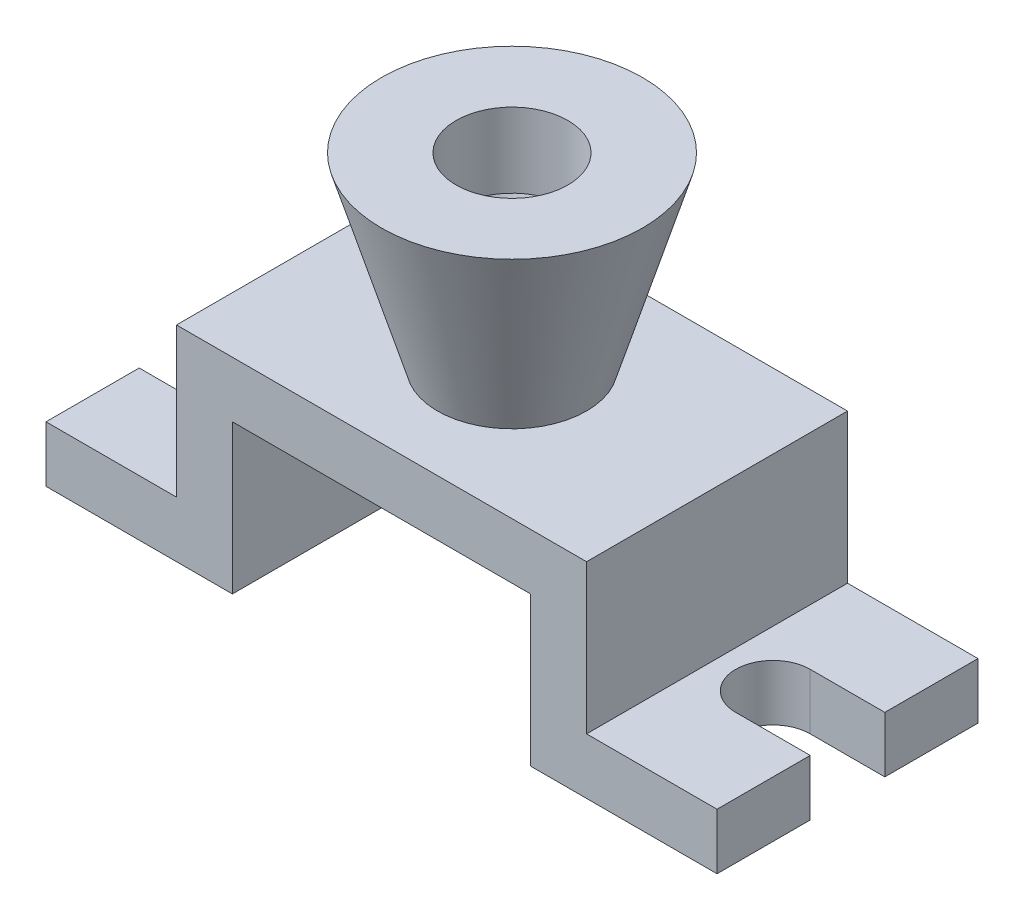
ISO-10303-21;
HEADER;
FILE_DESCRIPTION(('STEP AP214'),'2;1');
FILE_NAME('part.step','',(''),(''),'','','');
FILE_SCHEMA(('AUTOMOTIVE_DESIGN { 1 0 10303 214 1 1 1 1 }'));
ENDSEC;
DATA;
#1=APPLICATION_CONTEXT('core data for automotive mechanical design processes');
#2=APPLICATION_PROTOCOL_DEFINITION('international standard','automotive_design',2000,#1);
#3=PRODUCT_CONTEXT('',#1,'mechanical');
#4=PRODUCT('Part','Part','',(#3));
#5=PRODUCT_RELATED_PRODUCT_CATEGORY('part','',(#4));
#6=PRODUCT_DEFINITION_FORMATION('','',#4);
#7=PRODUCT_DEFINITION_CONTEXT('part definition',#1,'design');
#8=PRODUCT_DEFINITION('design','',#6,#7);
#9=PRODUCT_DEFINITION_SHAPE('','',#8);
#10=(LENGTH_UNIT() NAMED_UNIT(*) SI_UNIT(.MILLI.,.METRE.));
#11=(NAMED_UNIT(*) PLANE_ANGLE_UNIT() SI_UNIT($,.RADIAN.));
#12=(NAMED_UNIT(*) SI_UNIT($,.STERADIAN.) SOLID_ANGLE_UNIT());
#13=UNCERTAINTY_MEASURE_WITH_UNIT(LENGTH_MEASURE(1.E-05),#10,'distance_accuracy_value','');
#14=(GEOMETRIC_REPRESENTATION_CONTEXT(3) GLOBAL_UNCERTAINTY_ASSIGNED_CONTEXT((#13)) GLOBAL_UNIT_ASSIGNED_CONTEXT((#10,
#11,#12)) REPRESENTATION_CONTEXT('',''));
#15=CARTESIAN_POINT('',(0.,0.,0.));
#16=DIRECTION('',(0.,0.,1.));
#17=DIRECTION('',(1.,0.,0.));
#18=AXIS2_PLACEMENT_3D('',#15,#16,#17);
#19=CARTESIAN_POINT('',(-90.,15.,35.));
#20=DIRECTION('',(1.,0.,0.));
#21=DIRECTION('',(0.,0.,-1.));
#22=AXIS2_PLACEMENT_3D('',#19,#20,#21);
#23=PLANE('',#22);
#24=DIRECTION('',(0.,0.,-1.));
#25=VECTOR('',#24,1.);
#26=CARTESIAN_POINT('',(-90.,15.,35.));
#27=LINE('',#26,#25);
#28=CARTESIAN_POINT('',(-90.,15.,35.));
#29=VERTEX_POINT('',#28);
#30=CARTESIAN_POINT('',(-90.,15.,9.99999999999999));
#31=VERTEX_POINT('',#30);
#32=EDGE_CURVE('E275',#29,#31,#27,.T.);
#33=ORIENTED_EDGE('',*,*,#32,.T.);
#34=DIRECTION('',(0.,1.,0.));
#35=VECTOR('',#34,1.);
#36=CARTESIAN_POINT('',(-90.,0.,9.99999999999999));
#37=LINE('',#36,#35);
#38=CARTESIAN_POINT('',(-90.,0.,9.99999999999999));
#39=VERTEX_POINT('',#38);
#40=EDGE_CURVE('E202',#39,#31,#37,.T.);
#41=ORIENTED_EDGE('',*,*,#40,.F.);
#42=DIRECTION('',(0.,0.,-1.));
#43=VECTOR('',#42,1.);
#44=CARTESIAN_POINT('',(-90.,0.,35.));
#45=LINE('',#44,#43);
#46=CARTESIAN_POINT('',(-90.,0.,35.));
#47=VERTEX_POINT('',#46);
#48=EDGE_CURVE('E311',#47,#39,#45,.T.);
#49=ORIENTED_EDGE('',*,*,#48,.F.);
#50=DIRECTION('',(0.,-1.,0.));
#51=VECTOR('',#50,1.);
#52=CARTESIAN_POINT('',(-90.,15.,35.));
#53=LINE('',#52,#51);
#54=EDGE_CURVE('E222',#29,#47,#53,.T.);
#55=ORIENTED_EDGE('',*,*,#54,.F.);
#56=EDGE_LOOP('',(#33,#41,#49,#55));
#57=FACE_BOUND('',#56,.T.);
#58=ADVANCED_FACE('F33',(#57),#23,.F.);
#59=CARTESIAN_POINT('',(90.,0.,35.));
#60=DIRECTION('',(-1.,0.,0.));
#61=DIRECTION('',(0.,0.,1.));
#62=AXIS2_PLACEMENT_3D('',#59,#60,#61);
#63=PLANE('',#62);
#64=DIRECTION('',(0.,0.,-1.));
#65=VECTOR('',#64,1.);
#66=CARTESIAN_POINT('',(90.,15.,35.));
#67=LINE('',#66,#65);
#68=CARTESIAN_POINT('',(90.,15.,-9.99999999999999));
#69=VERTEX_POINT('',#68);
#70=CARTESIAN_POINT('',(90.,15.,-35.));
#71=VERTEX_POINT('',#70);
#72=EDGE_CURVE('E290',#69,#71,#67,.T.);
#73=ORIENTED_EDGE('',*,*,#72,.F.);
#74=DIRECTION('',(0.,1.,0.));
#75=VECTOR('',#74,1.);
#76=CARTESIAN_POINT('',(90.,0.,-9.99999999999999));
#77=LINE('',#76,#75);
#78=CARTESIAN_POINT('',(90.,0.,-9.99999999999999));
#79=VERTEX_POINT('',#78);
#80=EDGE_CURVE('E192',#79,#69,#77,.T.);
#81=ORIENTED_EDGE('',*,*,#80,.F.);
#82=DIRECTION('',(0.,0.,-1.));
#83=VECTOR('',#82,1.);
#84=CARTESIAN_POINT('',(90.,0.,35.));
#85=LINE('',#84,#83);
#86=CARTESIAN_POINT('',(90.,0.,-35.));
#87=VERTEX_POINT('',#86);
#88=EDGE_CURVE('E294',#79,#87,#85,.T.);
#89=ORIENTED_EDGE('',*,*,#88,.T.);
#90=DIRECTION('',(0.,1.,0.));
#91=VECTOR('',#90,1.);
#92=CARTESIAN_POINT('',(90.,0.,-35.));
#93=LINE('',#92,#91);
#94=EDGE_CURVE('E262',#87,#71,#93,.T.);
#95=ORIENTED_EDGE('',*,*,#94,.T.);
#96=EDGE_LOOP('',(#73,#81,#89,#95));
#97=FACE_BOUND('',#96,.T.);
#98=ADVANCED_FACE('F331',(#97),#63,.F.);
#99=CARTESIAN_POINT('',(-90.,0.,-9.99999999999999));
#100=VERTEX_POINT('',#99);
#101=CARTESIAN_POINT('',(-90.,0.,-35.));
#102=VERTEX_POINT('',#101);
#103=EDGE_CURVE('E310',#100,#102,#45,.T.);
#104=ORIENTED_EDGE('',*,*,#103,.F.);
#105=DIRECTION('',(0.,1.,0.));
#106=VECTOR('',#105,1.);
#107=CARTESIAN_POINT('',(-90.,0.,-9.99999999999999));
#108=LINE('',#107,#106);
#109=CARTESIAN_POINT('',(-90.,15.,-9.99999999999999));
#110=VERTEX_POINT('',#109);
#111=EDGE_CURVE('E177',#100,#110,#108,.T.);
#112=ORIENTED_EDGE('',*,*,#111,.T.);
#113=CARTESIAN_POINT('',(-90.,15.,-35.));
#114=VERTEX_POINT('',#113);
#115=EDGE_CURVE('E248',#110,#114,#27,.T.);
#116=ORIENTED_EDGE('',*,*,#115,.T.);
#117=DIRECTION('',(0.,-1.,0.));
#118=VECTOR('',#117,1.);
#119=CARTESIAN_POINT('',(-90.,15.,-35.));
#120=LINE('',#119,#118);
#121=EDGE_CURVE('E221',#114,#102,#120,.T.);
#122=ORIENTED_EDGE('',*,*,#121,.T.);
#123=EDGE_LOOP('',(#104,#112,#116,#122));
#124=FACE_BOUND('',#123,.T.);
#125=ADVANCED_FACE('F35',(#124),#23,.F.);
#126=CARTESIAN_POINT('',(-90.,0.,35.));
#127=DIRECTION('',(0.,1.,0.));
#128=DIRECTION('',(0.,0.,1.));
#129=AXIS2_PLACEMENT_3D('',#126,#127,#128);
#130=PLANE('',#129);
#131=ORIENTED_EDGE('',*,*,#48,.T.);
#132=DIRECTION('',(1.,0.,0.));
#133=VECTOR('',#132,1.);
#134=CARTESIAN_POINT('',(-70.,0.,9.99999999999999));
#135=LINE('',#134,#133);
#136=CARTESIAN_POINT('',(-70.,0.,9.99999999999999));
#137=VERTEX_POINT('',#136);
#138=EDGE_CURVE('E178',#39,#137,#135,.T.);
#139=ORIENTED_EDGE('',*,*,#138,.T.);
#140=CARTESIAN_POINT('',(-70.,0.,0.));
#141=DIRECTION('',(0.,1.,0.));
#142=DIRECTION('',(-1.,0.,0.));
#143=AXIS2_PLACEMENT_3D('',#140,#141,#142);
#144=CIRCLE('',#143,9.99999999999999);
#145=CARTESIAN_POINT('',(-70.,0.,-9.99999999999999));
#146=VERTEX_POINT('',#145);
#147=EDGE_CURVE('E172',#137,#146,#144,.T.);
#148=ORIENTED_EDGE('',*,*,#147,.T.);
#149=DIRECTION('',(-1.,0.,0.));
#150=VECTOR('',#149,1.);
#151=CARTESIAN_POINT('',(-70.,0.,-9.99999999999999));
#152=LINE('',#151,#150);
#153=EDGE_CURVE('E181',#146,#100,#152,.T.);
#154=ORIENTED_EDGE('',*,*,#153,.T.);
#155=ORIENTED_EDGE('',*,*,#103,.T.);
#156=DIRECTION('',(1.,0.,0.));
#157=VECTOR('',#156,1.);
#158=CARTESIAN_POINT('',(-90.,0.,-35.));
#159=LINE('',#158,#157);
#160=CARTESIAN_POINT('',(-40.,0.,-35.));
#161=VERTEX_POINT('',#160);
#162=EDGE_CURVE('E251',#102,#161,#159,.T.);
#163=ORIENTED_EDGE('',*,*,#162,.T.);
#164=DIRECTION('',(0.,0.,-1.));
#165=VECTOR('',#164,1.);
#166=CARTESIAN_POINT('',(-40.,0.,35.));
#167=LINE('',#166,#165);
#168=CARTESIAN_POINT('',(-40.,0.,35.));
#169=VERTEX_POINT('',#168);
#170=EDGE_CURVE('E307',#169,#161,#167,.T.);
#171=ORIENTED_EDGE('',*,*,#170,.F.);
#172=DIRECTION('',(1.,0.,0.));
#173=VECTOR('',#172,1.);
#174=CARTESIAN_POINT('',(-90.,0.,35.));
#175=LINE('',#174,#173);
#176=EDGE_CURVE('E225',#47,#169,#175,.T.);
#177=ORIENTED_EDGE('',*,*,#176,.F.);
#178=EDGE_LOOP('',(#131,#139,#148,#154,#155,#163,#171,#177));
#179=FACE_BOUND('',#178,.T.);
#180=ADVANCED_FACE('F188',(#179),#130,.F.);
#181=CARTESIAN_POINT('',(-40.,0.,35.));
#182=DIRECTION('',(-1.,0.,0.));
#183=DIRECTION('',(0.,0.,1.));
#184=AXIS2_PLACEMENT_3D('',#181,#182,#183);
#185=PLANE('',#184);
#186=DIRECTION('',(0.,1.,0.));
#187=VECTOR('',#186,1.);
#188=CARTESIAN_POINT('',(-40.,0.,-35.));
#189=LINE('',#188,#187);
#190=CARTESIAN_POINT('',(-40.,40.,-35.));
#191=VERTEX_POINT('',#190);
#192=EDGE_CURVE('E253',#161,#191,#189,.T.);
#193=ORIENTED_EDGE('',*,*,#192,.T.);
#194=DIRECTION('',(0.,0.,-1.));
#195=VECTOR('',#194,1.);
#196=CARTESIAN_POINT('',(-40.,40.,35.));
#197=LINE('',#196,#195);
#198=CARTESIAN_POINT('',(-40.,40.,35.));
#199=VERTEX_POINT('',#198);
#200=EDGE_CURVE('E304',#199,#191,#197,.T.);
#201=ORIENTED_EDGE('',*,*,#200,.F.);
#202=DIRECTION('',(0.,1.,0.));
#203=VECTOR('',#202,1.);
#204=CARTESIAN_POINT('',(-40.,0.,35.));
#205=LINE('',#204,#203);
#206=EDGE_CURVE('E228',#169,#199,#205,.T.);
#207=ORIENTED_EDGE('',*,*,#206,.F.);
#208=ORIENTED_EDGE('',*,*,#170,.T.);
#209=EDGE_LOOP('',(#193,#201,#207,#208));
#210=FACE_BOUND('',#209,.T.);
#211=ADVANCED_FACE('F386',(#210),#185,.F.);
#212=CARTESIAN_POINT('',(-40.,40.,35.));
#213=DIRECTION('',(0.,1.,0.));
#214=DIRECTION('',(0.,0.,1.));
#215=AXIS2_PLACEMENT_3D('',#212,#213,#214);
#216=PLANE('',#215);
#217=CARTESIAN_POINT('',(0.,40.,0.));
#218=DIRECTION('',(0.,1.,0.));
#219=DIRECTION('',(0.,0.,1.));
#220=AXIS2_PLACEMENT_3D('',#217,#218,#219);
#221=CIRCLE('',#220,8.);
#222=CARTESIAN_POINT('',(0.,40.,8.));
#223=VERTEX_POINT('',#222);
#224=EDGE_CURVE('E201',#223,#223,#221,.T.);
#225=ORIENTED_EDGE('',*,*,#224,.T.);
#226=EDGE_LOOP('',(#225));
#227=FACE_BOUND('',#226,.T.);
#228=DIRECTION('',(1.,0.,0.));
#229=VECTOR('',#228,1.);
#230=CARTESIAN_POINT('',(-40.,40.,-35.));
#231=LINE('',#230,#229);
#232=CARTESIAN_POINT('',(40.,40.,-35.));
#233=VERTEX_POINT('',#232);
#234=EDGE_CURVE('E255',#191,#233,#231,.T.);
#235=ORIENTED_EDGE('',*,*,#234,.T.);
#236=DIRECTION('',(0.,0.,-1.));
#237=VECTOR('',#236,1.);
#238=CARTESIAN_POINT('',(40.,40.,35.));
#239=LINE('',#238,#237);
#240=CARTESIAN_POINT('',(40.,40.,35.));
#241=VERTEX_POINT('',#240);
#242=EDGE_CURVE('E301',#241,#233,#239,.T.);
#243=ORIENTED_EDGE('',*,*,#242,.F.);
#244=DIRECTION('',(1.,0.,0.));
#245=VECTOR('',#244,1.);
#246=CARTESIAN_POINT('',(-40.,40.,35.));
#247=LINE('',#246,#245);
#248=EDGE_CURVE('E230',#199,#241,#247,.T.);
#249=ORIENTED_EDGE('',*,*,#248,.F.);
#250=ORIENTED_EDGE('',*,*,#200,.T.);
#251=EDGE_LOOP('',(#235,#243,#249,#250));
#252=FACE_BOUND('',#251,.T.);
#253=ADVANCED_FACE('F399',(#227,#252),#216,.F.);
#254=CARTESIAN_POINT('',(40.,40.,35.));
#255=DIRECTION('',(1.,0.,0.));
#256=DIRECTION('',(0.,0.,-1.));
#257=AXIS2_PLACEMENT_3D('',#254,#255,#256);
#258=PLANE('',#257);
#259=DIRECTION('',(0.,-1.,0.));
#260=VECTOR('',#259,1.);
#261=CARTESIAN_POINT('',(40.,40.,-35.));
#262=LINE('',#261,#260);
#263=CARTESIAN_POINT('',(40.,0.,-35.));
#264=VERTEX_POINT('',#263);
#265=EDGE_CURVE('E257',#233,#264,#262,.T.);
#266=ORIENTED_EDGE('',*,*,#265,.T.);
#267=DIRECTION('',(0.,0.,-1.));
#268=VECTOR('',#267,1.);
#269=CARTESIAN_POINT('',(40.,0.,35.));
#270=LINE('',#269,#268);
#271=CARTESIAN_POINT('',(40.,0.,35.));
#272=VERTEX_POINT('',#271);
#273=EDGE_CURVE('E298',#272,#264,#270,.T.);
#274=ORIENTED_EDGE('',*,*,#273,.F.);
#275=DIRECTION('',(0.,-1.,0.));
#276=VECTOR('',#275,1.);
#277=CARTESIAN_POINT('',(40.,40.,35.));
#278=LINE('',#277,#276);
#279=EDGE_CURVE('E232',#241,#272,#278,.T.);
#280=ORIENTED_EDGE('',*,*,#279,.F.);
#281=ORIENTED_EDGE('',*,*,#242,.T.);
#282=EDGE_LOOP('',(#266,#274,#280,#281));
#283=FACE_BOUND('',#282,.T.);
#284=ADVANCED_FACE('F436',(#283),#258,.F.);
#285=CARTESIAN_POINT('',(40.,0.,35.));
#286=DIRECTION('',(0.,1.,0.));
#287=DIRECTION('',(0.,0.,1.));
#288=AXIS2_PLACEMENT_3D('',#285,#286,#287);
#289=PLANE('',#288);
#290=ORIENTED_EDGE('',*,*,#88,.F.);
#291=DIRECTION('',(-1.,0.,0.));
#292=VECTOR('',#291,1.);
#293=CARTESIAN_POINT('',(70.,0.,-9.99999999999999));
#294=LINE('',#293,#292);
#295=CARTESIAN_POINT('',(70.,0.,-9.99999999999999));
#296=VERTEX_POINT('',#295);
#297=EDGE_CURVE('E211',#79,#296,#294,.T.);
#298=ORIENTED_EDGE('',*,*,#297,.T.);
#299=CARTESIAN_POINT('',(70.,0.,0.));
#300=DIRECTION('',(0.,1.,0.));
#301=DIRECTION('',(1.,0.,0.));
#302=AXIS2_PLACEMENT_3D('',#299,#300,#301);
#303=CIRCLE('',#302,9.99999999999999);
#304=CARTESIAN_POINT('',(70.,0.,9.99999999999999));
#305=VERTEX_POINT('',#304);
#306=EDGE_CURVE('E205',#296,#305,#303,.T.);
#307=ORIENTED_EDGE('',*,*,#306,.T.);
#308=DIRECTION('',(1.,0.,0.));
#309=VECTOR('',#308,1.);
#310=CARTESIAN_POINT('',(70.,0.,9.99999999999999));
#311=LINE('',#310,#309);
#312=CARTESIAN_POINT('',(90.,0.,9.99999999999999));
#313=VERTEX_POINT('',#312);
#314=EDGE_CURVE('E208',#305,#313,#311,.T.);
#315=ORIENTED_EDGE('',*,*,#314,.T.);
#316=CARTESIAN_POINT('',(90.,0.,35.));
#317=VERTEX_POINT('',#316);
#318=EDGE_CURVE('E295',#317,#313,#85,.T.);
#319=ORIENTED_EDGE('',*,*,#318,.F.);
#320=DIRECTION('',(1.,0.,0.));
#321=VECTOR('',#320,1.);
#322=CARTESIAN_POINT('',(40.,0.,35.));
#323=LINE('',#322,#321);
#324=EDGE_CURVE('E234',#272,#317,#323,.T.);
#325=ORIENTED_EDGE('',*,*,#324,.F.);
#326=ORIENTED_EDGE('',*,*,#273,.T.);
#327=DIRECTION('',(1.,0.,0.));
#328=VECTOR('',#327,1.);
#329=CARTESIAN_POINT('',(40.,0.,-35.));
#330=LINE('',#329,#328);
#331=EDGE_CURVE('E259',#264,#87,#330,.T.);
#332=ORIENTED_EDGE('',*,*,#331,.T.);
#333=EDGE_LOOP('',(#290,#298,#307,#315,#319,#325,#326,#332));
#334=FACE_BOUND('',#333,.T.);
#335=ADVANCED_FACE('F358',(#334),#289,.F.);
#336=ORIENTED_EDGE('',*,*,#318,.T.);
#337=DIRECTION('',(0.,1.,0.));
#338=VECTOR('',#337,1.);
#339=CARTESIAN_POINT('',(90.,0.,9.99999999999999));
#340=LINE('',#339,#338);
#341=CARTESIAN_POINT('',(90.,15.,9.99999999999999));
#342=VERTEX_POINT('',#341);
#343=EDGE_CURVE('E215',#313,#342,#340,.T.);
#344=ORIENTED_EDGE('',*,*,#343,.T.);
#345=CARTESIAN_POINT('',(90.,15.,35.));
#346=VERTEX_POINT('',#345);
#347=EDGE_CURVE('E291',#346,#342,#67,.T.);
#348=ORIENTED_EDGE('',*,*,#347,.F.);
#349=DIRECTION('',(0.,1.,0.));
#350=VECTOR('',#349,1.);
#351=CARTESIAN_POINT('',(90.,0.,35.));
#352=LINE('',#351,#350);
#353=EDGE_CURVE('E236',#317,#346,#352,.T.);
#354=ORIENTED_EDGE('',*,*,#353,.F.);
#355=EDGE_LOOP('',(#336,#344,#348,#354));
#356=FACE_BOUND('',#355,.T.);
#357=ADVANCED_FACE('F354',(#356),#63,.F.);
#358=CARTESIAN_POINT('',(90.,15.,35.));
#359=DIRECTION('',(0.,-1.,0.));
#360=DIRECTION('',(1.,0.,0.));
#361=AXIS2_PLACEMENT_3D('',#358,#359,#360);
#362=PLANE('',#361);
#363=CARTESIAN_POINT('',(70.,15.,0.));
#364=DIRECTION('',(0.,-1.,0.));
#365=DIRECTION('',(1.,0.,0.));
#366=AXIS2_PLACEMENT_3D('',#363,#364,#365);
#367=CIRCLE('',#366,9.99999999999999);
#368=CARTESIAN_POINT('',(70.,15.,9.99999999999999));
#369=VERTEX_POINT('',#368);
#370=CARTESIAN_POINT('',(70.,15.,-9.99999999999999));
#371=VERTEX_POINT('',#370);
#372=EDGE_CURVE('E322',#369,#371,#367,.T.);
#373=ORIENTED_EDGE('',*,*,#372,.T.);
#374=DIRECTION('',(1.,0.,0.));
#375=VECTOR('',#374,1.);
#376=CARTESIAN_POINT('',(90.,15.,-9.99999999999999));
#377=LINE('',#376,#375);
#378=EDGE_CURVE('E41',#371,#69,#377,.T.);
#379=ORIENTED_EDGE('',*,*,#378,.T.);
#380=ORIENTED_EDGE('',*,*,#72,.T.);
#381=DIRECTION('',(-1.,0.,0.));
#382=VECTOR('',#381,1.);
#383=CARTESIAN_POINT('',(90.,15.,-35.));
#384=LINE('',#383,#382);
#385=CARTESIAN_POINT('',(55.,15.,-35.));
#386=VERTEX_POINT('',#385);
#387=EDGE_CURVE('E265',#71,#386,#384,.T.);
#388=ORIENTED_EDGE('',*,*,#387,.T.);
#389=DIRECTION('',(0.,0.,-1.));
#390=VECTOR('',#389,1.);
#391=CARTESIAN_POINT('',(55.,15.,35.));
#392=LINE('',#391,#390);
#393=CARTESIAN_POINT('',(55.,15.,35.));
#394=VERTEX_POINT('',#393);
#395=EDGE_CURVE('E287',#394,#386,#392,.T.);
#396=ORIENTED_EDGE('',*,*,#395,.F.);
#397=DIRECTION('',(-1.,0.,0.));
#398=VECTOR('',#397,1.);
#399=CARTESIAN_POINT('',(90.,15.,35.));
#400=LINE('',#399,#398);
#401=EDGE_CURVE('E238',#346,#394,#400,.T.);
#402=ORIENTED_EDGE('',*,*,#401,.F.);
#403=ORIENTED_EDGE('',*,*,#347,.T.);
#404=DIRECTION('',(-1.,0.,0.));
#405=VECTOR('',#404,1.);
#406=CARTESIAN_POINT('',(90.,15.,9.99999999999999));
#407=LINE('',#406,#405);
#408=EDGE_CURVE('E319',#342,#369,#407,.T.);
#409=ORIENTED_EDGE('',*,*,#408,.T.);
#410=EDGE_LOOP('',(#373,#379,#380,#388,#396,#402,#403,#409));
#411=FACE_BOUND('',#410,.T.);
#412=ADVANCED_FACE('F327',(#411),#362,.F.);
#413=CARTESIAN_POINT('',(55.,15.,35.));
#414=DIRECTION('',(-1.,0.,0.));
#415=DIRECTION('',(0.,-1.,0.));
#416=AXIS2_PLACEMENT_3D('',#413,#414,#415);
#417=PLANE('',#416);
#418=DIRECTION('',(0.,1.,0.));
#419=VECTOR('',#418,1.);
#420=CARTESIAN_POINT('',(55.,15.,-35.));
#421=LINE('',#420,#419);
#422=CARTESIAN_POINT('',(55.,55.,-35.));
#423=VERTEX_POINT('',#422);
#424=EDGE_CURVE('E267',#386,#423,#421,.T.);
#425=ORIENTED_EDGE('',*,*,#424,.T.);
#426=DIRECTION('',(0.,0.,-1.));
#427=VECTOR('',#426,1.);
#428=CARTESIAN_POINT('',(55.,55.,35.));
#429=LINE('',#428,#427);
#430=CARTESIAN_POINT('',(55.,55.,35.));
#431=VERTEX_POINT('',#430);
#432=EDGE_CURVE('E284',#431,#423,#429,.T.);
#433=ORIENTED_EDGE('',*,*,#432,.F.);
#434=DIRECTION('',(0.,1.,0.));
#435=VECTOR('',#434,1.);
#436=CARTESIAN_POINT('',(55.,15.,35.));
#437=LINE('',#436,#435);
#438=EDGE_CURVE('E240',#394,#431,#437,.T.);
#439=ORIENTED_EDGE('',*,*,#438,.F.);
#440=ORIENTED_EDGE('',*,*,#395,.T.);
#441=EDGE_LOOP('',(#425,#433,#439,#440));
#442=FACE_BOUND('',#441,.T.);
#443=ADVANCED_FACE('F345',(#442),#417,.F.);
#444=CARTESIAN_POINT('',(55.,55.,35.));
#445=DIRECTION('',(0.,-1.,0.));
#446=DIRECTION('',(1.,0.,0.));
#447=AXIS2_PLACEMENT_3D('',#444,#445,#446);
#448=PLANE('',#447);
#449=CARTESIAN_POINT('',(0.,55.,0.));
#450=DIRECTION('',(0.,-1.,0.));
#451=DIRECTION('',(1.,0.,0.));
#452=AXIS2_PLACEMENT_3D('',#449,#450,#451);
#453=CIRCLE('',#452,20.);
#454=CARTESIAN_POINT('',(20.,55.,0.));
#455=VERTEX_POINT('',#454);
#456=EDGE_CURVE('E11',#455,#455,#453,.F.);
#457=ORIENTED_EDGE('',*,*,#456,.F.);
#458=EDGE_LOOP('',(#457));
#459=FACE_BOUND('',#458,.T.);
#460=DIRECTION('',(-1.,0.,0.));
#461=VECTOR('',#460,1.);
#462=CARTESIAN_POINT('',(55.,55.,-35.));
#463=LINE('',#462,#461);
#464=CARTESIAN_POINT('',(-55.,55.,-35.));
#465=VERTEX_POINT('',#464);
#466=EDGE_CURVE('E269',#423,#465,#463,.T.);
#467=ORIENTED_EDGE('',*,*,#466,.T.);
#468=DIRECTION('',(0.,0.,-1.));
#469=VECTOR('',#468,1.);
#470=CARTESIAN_POINT('',(-55.,55.,35.));
#471=LINE('',#470,#469);
#472=CARTESIAN_POINT('',(-55.,55.,35.));
#473=VERTEX_POINT('',#472);
#474=EDGE_CURVE('E281',#473,#465,#471,.T.);
#475=ORIENTED_EDGE('',*,*,#474,.F.);
#476=DIRECTION('',(-1.,0.,0.));
#477=VECTOR('',#476,1.);
#478=CARTESIAN_POINT('',(55.,55.,35.));
#479=LINE('',#478,#477);
#480=EDGE_CURVE('E242',#431,#473,#479,.T.);
#481=ORIENTED_EDGE('',*,*,#480,.F.);
#482=ORIENTED_EDGE('',*,*,#432,.T.);
#483=EDGE_LOOP('',(#467,#475,#481,#482));
#484=FACE_BOUND('',#483,.T.);
#485=ADVANCED_FACE('F418',(#459,#484),#448,.F.);
#486=CARTESIAN_POINT('',(-55.,55.,35.));
#487=DIRECTION('',(1.,0.,0.));
#488=DIRECTION('',(0.,1.,0.));
#489=AXIS2_PLACEMENT_3D('',#486,#487,#488);
#490=PLANE('',#489);
#491=DIRECTION('',(0.,-1.,0.));
#492=VECTOR('',#491,1.);
#493=CARTESIAN_POINT('',(-55.,55.,-35.));
#494=LINE('',#493,#492);
#495=CARTESIAN_POINT('',(-55.,15.,-35.));
#496=VERTEX_POINT('',#495);
#497=EDGE_CURVE('E271',#465,#496,#494,.T.);
#498=ORIENTED_EDGE('',*,*,#497,.T.);
#499=DIRECTION('',(0.,0.,-1.));
#500=VECTOR('',#499,1.);
#501=CARTESIAN_POINT('',(-55.,15.,35.));
#502=LINE('',#501,#500);
#503=CARTESIAN_POINT('',(-55.,15.,35.));
#504=VERTEX_POINT('',#503);
#505=EDGE_CURVE('E278',#504,#496,#502,.T.);
#506=ORIENTED_EDGE('',*,*,#505,.F.);
#507=DIRECTION('',(0.,-1.,0.));
#508=VECTOR('',#507,1.);
#509=CARTESIAN_POINT('',(-55.,55.,35.));
#510=LINE('',#509,#508);
#511=EDGE_CURVE('E244',#473,#504,#510,.T.);
#512=ORIENTED_EDGE('',*,*,#511,.F.);
#513=ORIENTED_EDGE('',*,*,#474,.T.);
#514=EDGE_LOOP('',(#498,#506,#512,#513));
#515=FACE_BOUND('',#514,.T.);
#516=ADVANCED_FACE('F415',(#515),#490,.F.);
#517=CARTESIAN_POINT('',(-55.,15.,35.));
#518=DIRECTION('',(0.,-1.,0.));
#519=DIRECTION('',(1.,0.,0.));
#520=AXIS2_PLACEMENT_3D('',#517,#518,#519);
#521=PLANE('',#520);
#522=CARTESIAN_POINT('',(-70.,15.,0.));
#523=DIRECTION('',(0.,-1.,0.));
#524=DIRECTION('',(1.,0.,0.));
#525=AXIS2_PLACEMENT_3D('',#522,#523,#524);
#526=CIRCLE('',#525,9.99999999999999);
#527=CARTESIAN_POINT('',(-70.,15.,-9.99999999999999));
#528=VERTEX_POINT('',#527);
#529=CARTESIAN_POINT('',(-70.,15.,9.99999999999999));
#530=VERTEX_POINT('',#529);
#531=EDGE_CURVE('E175',#528,#530,#526,.T.);
#532=ORIENTED_EDGE('',*,*,#531,.T.);
#533=DIRECTION('',(-1.,0.,0.));
#534=VECTOR('',#533,1.);
#535=CARTESIAN_POINT('',(-55.,15.,9.99999999999999));
#536=LINE('',#535,#534);
#537=EDGE_CURVE('E316',#530,#31,#536,.T.);
#538=ORIENTED_EDGE('',*,*,#537,.T.);
#539=ORIENTED_EDGE('',*,*,#32,.F.);
#540=DIRECTION('',(-1.,0.,0.));
#541=VECTOR('',#540,1.);
#542=CARTESIAN_POINT('',(-55.,15.,35.));
#543=LINE('',#542,#541);
#544=EDGE_CURVE('E246',#504,#29,#543,.T.);
#545=ORIENTED_EDGE('',*,*,#544,.F.);
#546=ORIENTED_EDGE('',*,*,#505,.T.);
#547=DIRECTION('',(-1.,0.,0.));
#548=VECTOR('',#547,1.);
#549=CARTESIAN_POINT('',(-55.,15.,-35.));
#550=LINE('',#549,#548);
#551=EDGE_CURVE('E226',#496,#114,#550,.T.);
#552=ORIENTED_EDGE('',*,*,#551,.T.);
#553=ORIENTED_EDGE('',*,*,#115,.F.);
#554=DIRECTION('',(1.,0.,0.));
#555=VECTOR('',#554,1.);
#556=CARTESIAN_POINT('',(-55.,15.,-9.99999999999999));
#557=LINE('',#556,#555);
#558=EDGE_CURVE('E313',#110,#528,#557,.T.);
#559=ORIENTED_EDGE('',*,*,#558,.T.);
#560=EDGE_LOOP('',(#532,#538,#539,#545,#546,#552,#553,#559));
#561=FACE_BOUND('',#560,.T.);
#562=ADVANCED_FACE('F410',(#561),#521,.F.);
#563=CARTESIAN_POINT('',(0.,0.,35.));
#564=DIRECTION('',(0.,0.,1.));
#565=DIRECTION('',(1.,0.,0.));
#566=AXIS2_PLACEMENT_3D('',#563,#564,#565);
#567=PLANE('',#566);
#568=ORIENTED_EDGE('',*,*,#54,.T.);
#569=ORIENTED_EDGE('',*,*,#176,.T.);
#570=ORIENTED_EDGE('',*,*,#206,.T.);
#571=ORIENTED_EDGE('',*,*,#248,.T.);
#572=ORIENTED_EDGE('',*,*,#279,.T.);
#573=ORIENTED_EDGE('',*,*,#324,.T.);
#574=ORIENTED_EDGE('',*,*,#353,.T.);
#575=ORIENTED_EDGE('',*,*,#401,.T.);
#576=ORIENTED_EDGE('',*,*,#438,.T.);
#577=ORIENTED_EDGE('',*,*,#480,.T.);
#578=ORIENTED_EDGE('',*,*,#511,.T.);
#579=ORIENTED_EDGE('',*,*,#544,.T.);
#580=EDGE_LOOP('',(#568,#569,#570,#571,#572,#573,#574,#575,#576,#577,#578,#579));
#581=FACE_BOUND('',#580,.T.);
#582=ADVANCED_FACE('F349',(#581),#567,.T.);
#583=CARTESIAN_POINT('',(0.,0.,-35.));
#584=DIRECTION('',(0.,0.,1.));
#585=DIRECTION('',(1.,0.,0.));
#586=AXIS2_PLACEMENT_3D('',#583,#584,#585);
#587=PLANE('',#586);
#588=ORIENTED_EDGE('',*,*,#121,.F.);
#589=ORIENTED_EDGE('',*,*,#551,.F.);
#590=ORIENTED_EDGE('',*,*,#497,.F.);
#591=ORIENTED_EDGE('',*,*,#466,.F.);
#592=ORIENTED_EDGE('',*,*,#424,.F.);
#593=ORIENTED_EDGE('',*,*,#387,.F.);
#594=ORIENTED_EDGE('',*,*,#94,.F.);
#595=ORIENTED_EDGE('',*,*,#331,.F.);
#596=ORIENTED_EDGE('',*,*,#265,.F.);
#597=ORIENTED_EDGE('',*,*,#234,.F.);
#598=ORIENTED_EDGE('',*,*,#192,.F.);
#599=ORIENTED_EDGE('',*,*,#162,.F.);
#600=EDGE_LOOP('',(#588,#589,#590,#591,#592,#593,#594,#595,#596,#597,#598,#599));
#601=FACE_BOUND('',#600,.T.);
#602=ADVANCED_FACE('F339',(#601),#587,.F.);
#603=CARTESIAN_POINT('',(-70.,0.,0.));
#604=DIRECTION('',(0.,1.,0.));
#605=DIRECTION('',(-1.,0.,0.));
#606=AXIS2_PLACEMENT_3D('',#603,#604,#605);
#607=CYLINDRICAL_SURFACE('',#606,9.99999999999999);
#608=DIRECTION('',(0.,1.,0.));
#609=VECTOR('',#608,1.);
#610=CARTESIAN_POINT('',(-70.,0.,-9.99999999999999));
#611=LINE('',#610,#609);
#612=EDGE_CURVE('E56',#146,#528,#611,.T.);
#613=ORIENTED_EDGE('',*,*,#612,.F.);
#614=ORIENTED_EDGE('',*,*,#147,.F.);
#615=DIRECTION('',(0.,1.,0.));
#616=VECTOR('',#615,1.);
#617=CARTESIAN_POINT('',(-70.,0.,9.99999999999999));
#618=LINE('',#617,#616);
#619=EDGE_CURVE('E199',#137,#530,#618,.T.);
#620=ORIENTED_EDGE('',*,*,#619,.T.);
#621=ORIENTED_EDGE('',*,*,#531,.F.);
#622=EDGE_LOOP('',(#613,#614,#620,#621));
#623=FACE_BOUND('',#622,.T.);
#624=ADVANCED_FACE('F169',(#623),#607,.F.);
#625=CARTESIAN_POINT('',(-70.,0.,9.99999999999999));
#626=DIRECTION('',(0.,0.,1.));
#627=DIRECTION('',(1.,0.,0.));
#628=AXIS2_PLACEMENT_3D('',#625,#626,#627);
#629=PLANE('',#628);
#630=ORIENTED_EDGE('',*,*,#619,.F.);
#631=ORIENTED_EDGE('',*,*,#138,.F.);
#632=ORIENTED_EDGE('',*,*,#40,.T.);
#633=ORIENTED_EDGE('',*,*,#537,.F.);
#634=EDGE_LOOP('',(#630,#631,#632,#633));
#635=FACE_BOUND('',#634,.T.);
#636=ADVANCED_FACE('F408',(#635),#629,.F.);
#637=CARTESIAN_POINT('',(-70.,0.,-9.99999999999999));
#638=DIRECTION('',(0.,0.,-1.));
#639=DIRECTION('',(-1.,0.,0.));
#640=AXIS2_PLACEMENT_3D('',#637,#638,#639);
#641=PLANE('',#640);
#642=ORIENTED_EDGE('',*,*,#111,.F.);
#643=ORIENTED_EDGE('',*,*,#153,.F.);
#644=ORIENTED_EDGE('',*,*,#612,.T.);
#645=ORIENTED_EDGE('',*,*,#558,.F.);
#646=EDGE_LOOP('',(#642,#643,#644,#645));
#647=FACE_BOUND('',#646,.T.);
#648=ADVANCED_FACE('F182',(#647),#641,.F.);
#649=CARTESIAN_POINT('',(0.,0.,0.));
#650=DIRECTION('',(0.,1.,0.));
#651=DIRECTION('',(-1.,0.,0.));
#652=AXIS2_PLACEMENT_3D('',#649,#650,#651);
#653=CYLINDRICAL_SURFACE('',#652,8.);
#654=ORIENTED_EDGE('',*,*,#224,.F.);
#655=EDGE_LOOP('',(#654));
#656=FACE_BOUND('',#655,.T.);
#657=CARTESIAN_POINT('',(0.,70.,0.));
#658=DIRECTION('',(0.,-1.,0.));
#659=DIRECTION('',(0.,0.,-1.));
#660=AXIS2_PLACEMENT_3D('',#657,#658,#659);
#661=CIRCLE('',#660,8.);
#662=CARTESIAN_POINT('',(0.,70.,-8.));
#663=VERTEX_POINT('',#662);
#664=EDGE_CURVE('E627',#663,#663,#661,.T.);
#665=ORIENTED_EDGE('',*,*,#664,.F.);
#666=EDGE_LOOP('',(#665));
#667=FACE_BOUND('',#666,.T.);
#668=ADVANCED_FACE('F372',(#656,#667),#653,.F.);
#669=CARTESIAN_POINT('',(70.,0.,0.));
#670=DIRECTION('',(0.,1.,0.));
#671=DIRECTION('',(-1.,0.,0.));
#672=AXIS2_PLACEMENT_3D('',#669,#670,#671);
#673=CYLINDRICAL_SURFACE('',#672,9.99999999999999);
#674=DIRECTION('',(0.,1.,0.));
#675=VECTOR('',#674,1.);
#676=CARTESIAN_POINT('',(70.,0.,9.99999999999999));
#677=LINE('',#676,#675);
#678=EDGE_CURVE('E48',#305,#369,#677,.T.);
#679=ORIENTED_EDGE('',*,*,#678,.F.);
#680=ORIENTED_EDGE('',*,*,#306,.F.);
#681=DIRECTION('',(0.,1.,0.));
#682=VECTOR('',#681,1.);
#683=CARTESIAN_POINT('',(70.,0.,-9.99999999999999));
#684=LINE('',#683,#682);
#685=EDGE_CURVE('E189',#296,#371,#684,.T.);
#686=ORIENTED_EDGE('',*,*,#685,.T.);
#687=ORIENTED_EDGE('',*,*,#372,.F.);
#688=EDGE_LOOP('',(#679,#680,#686,#687));
#689=FACE_BOUND('',#688,.T.);
#690=ADVANCED_FACE('F362',(#689),#673,.F.);
#691=CARTESIAN_POINT('',(70.,0.,-9.99999999999999));
#692=DIRECTION('',(0.,0.,-1.));
#693=DIRECTION('',(-1.,0.,0.));
#694=AXIS2_PLACEMENT_3D('',#691,#692,#693);
#695=PLANE('',#694);
#696=ORIENTED_EDGE('',*,*,#685,.F.);
#697=ORIENTED_EDGE('',*,*,#297,.F.);
#698=ORIENTED_EDGE('',*,*,#80,.T.);
#699=ORIENTED_EDGE('',*,*,#378,.F.);
#700=EDGE_LOOP('',(#696,#697,#698,#699));
#701=FACE_BOUND('',#700,.T.);
#702=ADVANCED_FACE('F363',(#701),#695,.F.);
#703=CARTESIAN_POINT('',(70.,0.,9.99999999999999));
#704=DIRECTION('',(0.,0.,1.));
#705=DIRECTION('',(1.,0.,0.));
#706=AXIS2_PLACEMENT_3D('',#703,#704,#705);
#707=PLANE('',#706);
#708=ORIENTED_EDGE('',*,*,#343,.F.);
#709=ORIENTED_EDGE('',*,*,#314,.F.);
#710=ORIENTED_EDGE('',*,*,#678,.T.);
#711=ORIENTED_EDGE('',*,*,#408,.F.);
#712=EDGE_LOOP('',(#708,#709,#710,#711));
#713=FACE_BOUND('',#712,.T.);
#714=ADVANCED_FACE('F356',(#713),#707,.F.);
#715=CARTESIAN_POINT('',(0.,105.,0.));
#716=DIRECTION('',(0.,1.,0.));
#717=DIRECTION('',(0.,0.,1.));
#718=AXIS2_PLACEMENT_3D('',#715,#716,#717);
#719=CONICAL_SURFACE('',#718,35.,0.291456794477867);
#720=ORIENTED_EDGE('',*,*,#456,.T.);
#721=EDGE_LOOP('',(#720));
#722=FACE_BOUND('',#721,.T.);
#723=CARTESIAN_POINT('',(0.,105.,0.));
#724=DIRECTION('',(0.,-1.,0.));
#725=DIRECTION('',(0.,0.,-1.));
#726=AXIS2_PLACEMENT_3D('',#723,#724,#725);
#727=CIRCLE('',#726,35.);
#728=CARTESIAN_POINT('',(0.,105.,-35.));
#729=VERTEX_POINT('',#728);
#730=EDGE_CURVE('E195',#729,#729,#727,.T.);
#731=ORIENTED_EDGE('',*,*,#730,.T.);
#732=EDGE_LOOP('',(#731));
#733=FACE_BOUND('',#732,.T.);
#734=ADVANCED_FACE('F370',(#722,#733),#719,.T.);
#735=CARTESIAN_POINT('',(-35.,105.,0.));
#736=DIRECTION('',(0.,-1.,0.));
#737=DIRECTION('',(0.,0.,-1.));
#738=AXIS2_PLACEMENT_3D('',#735,#736,#737);
#739=PLANE('',#738);
#740=ORIENTED_EDGE('',*,*,#730,.F.);
#741=EDGE_LOOP('',(#740));
#742=FACE_BOUND('',#741,.T.);
#743=CARTESIAN_POINT('',(0.,105.,0.));
#744=DIRECTION('',(0.,-1.,0.));
#745=DIRECTION('',(0.,0.,-1.));
#746=AXIS2_PLACEMENT_3D('',#743,#744,#745);
#747=CIRCLE('',#746,15.);
#748=CARTESIAN_POINT('',(0.,105.,-15.));
#749=VERTEX_POINT('',#748);
#750=EDGE_CURVE('E630',#749,#749,#747,.T.);
#751=ORIENTED_EDGE('',*,*,#750,.T.);
#752=EDGE_LOOP('',(#751));
#753=FACE_BOUND('',#752,.T.);
#754=ADVANCED_FACE('F587',(#742,#753),#739,.F.);
#755=CARTESIAN_POINT('',(0.,55.,0.));
#756=DIRECTION('',(0.,-1.,0.));
#757=DIRECTION('',(0.,0.,-1.));
#758=AXIS2_PLACEMENT_3D('',#755,#756,#757);
#759=CYLINDRICAL_SURFACE('',#758,15.);
#760=ORIENTED_EDGE('',*,*,#750,.F.);
#761=EDGE_LOOP('',(#760));
#762=FACE_BOUND('',#761,.T.);
#763=CARTESIAN_POINT('',(0.,85.,0.));
#764=DIRECTION('',(0.,-1.,0.));
#765=DIRECTION('',(0.,0.,-1.));
#766=AXIS2_PLACEMENT_3D('',#763,#764,#765);
#767=CIRCLE('',#766,15.);
#768=CARTESIAN_POINT('',(0.,85.,-15.));
#769=VERTEX_POINT('',#768);
#770=EDGE_CURVE('E624',#769,#769,#767,.T.);
#771=ORIENTED_EDGE('',*,*,#770,.T.);
#772=EDGE_LOOP('',(#771));
#773=FACE_BOUND('',#772,.T.);
#774=ADVANCED_FACE('F597',(#762,#773),#759,.F.);
#775=CARTESIAN_POINT('',(0.,70.,0.));
#776=DIRECTION('',(0.,1.,0.));
#777=DIRECTION('',(0.,0.,1.));
#778=AXIS2_PLACEMENT_3D('',#775,#776,#777);
#779=CONICAL_SURFACE('',#778,8.,0.436627159813541);
#780=ORIENTED_EDGE('',*,*,#770,.F.);
#781=EDGE_LOOP('',(#780));
#782=FACE_BOUND('',#781,.T.);
#783=ORIENTED_EDGE('',*,*,#664,.T.);
#784=EDGE_LOOP('',(#783));
#785=FACE_BOUND('',#784,.T.);
#786=ADVANCED_FACE('F607',(#782,#785),#779,.F.);
#787=CLOSED_SHELL('',(#58,#98,#125,#180,#211,#253,#284,#335,#357,#412,#443,#485,#516,#562,#582,
#602,#624,#636,#648,#668,#690,#702,#714,#734,#754,#774,#786));
#788=MANIFOLD_SOLID_BREP('B2',#787);
#789=ADVANCED_BREP_SHAPE_REPRESENTATION('',(#18,#788),#14);
#790=SHAPE_DEFINITION_REPRESENTATION(#9,#789);
ENDSEC;
END-ISO-10303-21;
